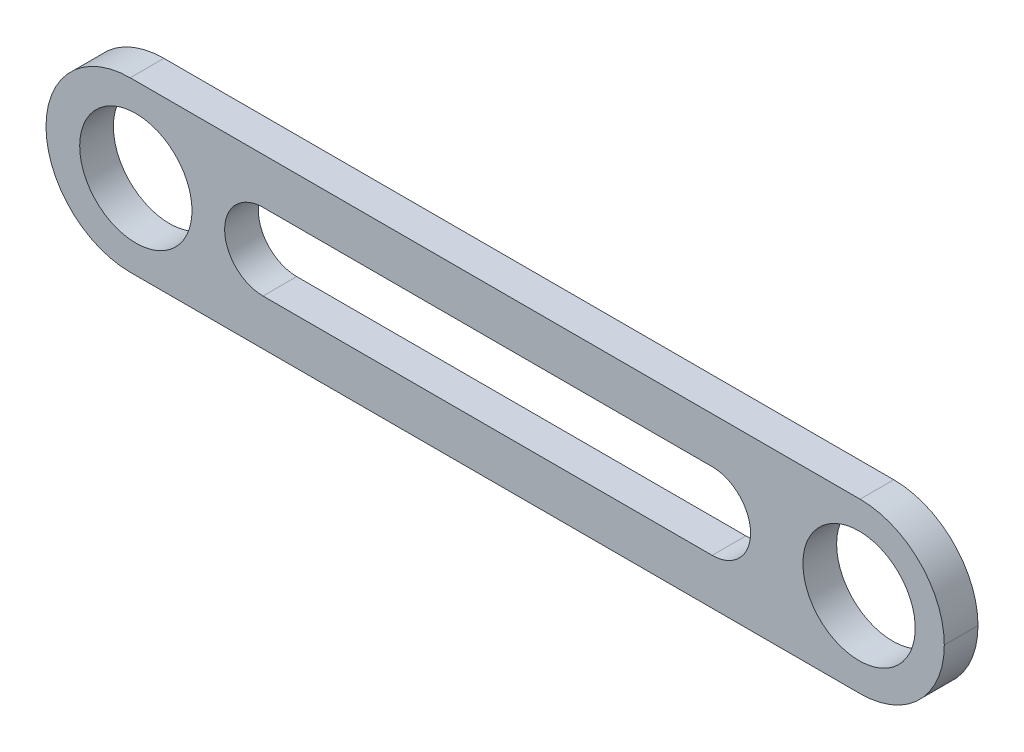
ISO-10303-21;
HEADER;
FILE_DESCRIPTION(('STEP AP214'),'2;1');
FILE_NAME('part.step','',(''),(''),'','','');
FILE_SCHEMA(('AUTOMOTIVE_DESIGN { 1 0 10303 214 1 1 1 1 }'));
ENDSEC;
DATA;
#1=APPLICATION_CONTEXT('core data for automotive mechanical design processes');
#2=APPLICATION_PROTOCOL_DEFINITION('international standard','automotive_design',2000,#1);
#3=PRODUCT_CONTEXT('',#1,'mechanical');
#4=PRODUCT('Part','Part','',(#3));
#5=PRODUCT_RELATED_PRODUCT_CATEGORY('part','',(#4));
#6=PRODUCT_DEFINITION_FORMATION('','',#4);
#7=PRODUCT_DEFINITION_CONTEXT('part definition',#1,'design');
#8=PRODUCT_DEFINITION('design','',#6,#7);
#9=PRODUCT_DEFINITION_SHAPE('','',#8);
#10=(LENGTH_UNIT() NAMED_UNIT(*) SI_UNIT(.MILLI.,.METRE.));
#11=(NAMED_UNIT(*) PLANE_ANGLE_UNIT() SI_UNIT($,.RADIAN.));
#12=(NAMED_UNIT(*) SI_UNIT($,.STERADIAN.) SOLID_ANGLE_UNIT());
#13=UNCERTAINTY_MEASURE_WITH_UNIT(LENGTH_MEASURE(1.E-05),#10,'distance_accuracy_value','');
#14=(GEOMETRIC_REPRESENTATION_CONTEXT(3) GLOBAL_UNCERTAINTY_ASSIGNED_CONTEXT((#13)) GLOBAL_UNIT_ASSIGNED_CONTEXT((#10,
#11,#12)) REPRESENTATION_CONTEXT('',''));
#15=CARTESIAN_POINT('',(0.,0.,0.));
#16=DIRECTION('',(0.,0.,1.));
#17=DIRECTION('',(1.,0.,0.));
#18=AXIS2_PLACEMENT_3D('',#15,#16,#17);
#19=CARTESIAN_POINT('',(0.,0.,7.62));
#20=DIRECTION('',(0.,0.,-1.));
#21=DIRECTION('',(-1.,0.,0.));
#22=AXIS2_PLACEMENT_3D('',#19,#20,#21);
#23=PLANE('',#22);
#24=CARTESIAN_POINT('',(-81.28,0.,7.62));
#25=DIRECTION('',(0.,0.,1.));
#26=DIRECTION('',(1.,0.,0.));
#27=AXIS2_PLACEMENT_3D('',#24,#25,#26);
#28=CIRCLE('',#27,12.7);
#29=CARTESIAN_POINT('',(-93.98,0.,7.62));
#30=VERTEX_POINT('',#29);
#31=EDGE_CURVE('E180',#30,#30,#28,.T.);
#32=ORIENTED_EDGE('',*,*,#31,.F.);
#33=EDGE_LOOP('',(#32));
#34=FACE_BOUND('',#33,.T.);
#35=DIRECTION('',(1.,0.,0.));
#36=VECTOR('',#35,1.);
#37=CARTESIAN_POINT('',(-101.6,-19.05,7.62));
#38=LINE('',#37,#36);
#39=CARTESIAN_POINT('',(-82.55,-19.05,7.62));
#40=VERTEX_POINT('',#39);
#41=CARTESIAN_POINT('',(82.55,-19.05,7.62));
#42=VERTEX_POINT('',#41);
#43=EDGE_CURVE('E191',#40,#42,#38,.T.);
#44=ORIENTED_EDGE('',*,*,#43,.T.);
#45=CARTESIAN_POINT('',(82.55,0.,7.62));
#46=DIRECTION('',(0.,0.,-1.));
#47=DIRECTION('',(-1.,0.,0.));
#48=AXIS2_PLACEMENT_3D('',#45,#46,#47);
#49=CIRCLE('',#48,19.05);
#50=CARTESIAN_POINT('',(101.6,0.,7.62));
#51=VERTEX_POINT('',#50);
#52=EDGE_CURVE('E229',#42,#51,#49,.F.);
#53=ORIENTED_EDGE('',*,*,#52,.T.);
#54=CARTESIAN_POINT('',(82.55,0.,7.62));
#55=DIRECTION('',(0.,0.,-1.));
#56=DIRECTION('',(-1.,0.,0.));
#57=AXIS2_PLACEMENT_3D('',#54,#55,#56);
#58=CIRCLE('',#57,19.05);
#59=CARTESIAN_POINT('',(82.55,19.05,7.62));
#60=VERTEX_POINT('',#59);
#61=EDGE_CURVE('E226',#51,#60,#58,.F.);
#62=ORIENTED_EDGE('',*,*,#61,.T.);
#63=DIRECTION('',(-1.,0.,0.));
#64=VECTOR('',#63,1.);
#65=CARTESIAN_POINT('',(-101.6,19.05,7.62));
#66=LINE('',#65,#64);
#67=CARTESIAN_POINT('',(-82.55,19.05,7.62));
#68=VERTEX_POINT('',#67);
#69=EDGE_CURVE('E188',#60,#68,#66,.T.);
#70=ORIENTED_EDGE('',*,*,#69,.T.);
#71=CARTESIAN_POINT('',(-82.55,0.,7.62));
#72=DIRECTION('',(0.,0.,-1.));
#73=DIRECTION('',(-1.,0.,0.));
#74=AXIS2_PLACEMENT_3D('',#71,#72,#73);
#75=CIRCLE('',#74,19.05);
#76=CARTESIAN_POINT('',(-101.6,0.,7.62));
#77=VERTEX_POINT('',#76);
#78=EDGE_CURVE('E61',#68,#77,#75,.F.);
#79=ORIENTED_EDGE('',*,*,#78,.T.);
#80=CARTESIAN_POINT('',(-82.55,0.,7.62));
#81=DIRECTION('',(0.,0.,-1.));
#82=DIRECTION('',(-1.,0.,0.));
#83=AXIS2_PLACEMENT_3D('',#80,#81,#82);
#84=CIRCLE('',#83,19.05);
#85=EDGE_CURVE('E223',#77,#40,#84,.F.);
#86=ORIENTED_EDGE('',*,*,#85,.T.);
#87=EDGE_LOOP('',(#44,#53,#62,#70,#79,#86));
#88=FACE_BOUND('',#87,.T.);
#89=CARTESIAN_POINT('',(-52.5116076429708,0.,7.62));
#90=DIRECTION('',(0.,0.,1.));
#91=DIRECTION('',(1.,0.,0.));
#92=AXIS2_PLACEMENT_3D('',#89,#90,#91);
#93=CIRCLE('',#92,8.68298343377441);
#94=CARTESIAN_POINT('',(-52.5116076429708,8.68298343377441,7.62));
#95=VERTEX_POINT('',#94);
#96=CARTESIAN_POINT('',(-52.5116076429708,-8.68298343377441,7.62));
#97=VERTEX_POINT('',#96);
#98=EDGE_CURVE('E124',#95,#97,#93,.T.);
#99=ORIENTED_EDGE('',*,*,#98,.F.);
#100=DIRECTION('',(-1.,0.,0.));
#101=VECTOR('',#100,1.);
#102=CARTESIAN_POINT('',(-52.5116076429708,8.68298343377441,7.62));
#103=LINE('',#102,#101);
#104=CARTESIAN_POINT('',(49.0883923570292,8.68298343377441,7.62));
#105=VERTEX_POINT('',#104);
#106=EDGE_CURVE('E154',#105,#95,#103,.T.);
#107=ORIENTED_EDGE('',*,*,#106,.F.);
#108=CARTESIAN_POINT('',(49.0883923570292,0.,7.62));
#109=DIRECTION('',(0.,0.,1.));
#110=DIRECTION('',(1.,0.,0.));
#111=AXIS2_PLACEMENT_3D('',#108,#109,#110);
#112=CIRCLE('',#111,8.68298343377441);
#113=CARTESIAN_POINT('',(49.0883923570292,-8.68298343377441,7.62));
#114=VERTEX_POINT('',#113);
#115=EDGE_CURVE('E150',#114,#105,#112,.T.);
#116=ORIENTED_EDGE('',*,*,#115,.F.);
#117=DIRECTION('',(1.,0.,0.));
#118=VECTOR('',#117,1.);
#119=CARTESIAN_POINT('',(-52.5116076429708,-8.68298343377441,7.62));
#120=LINE('',#119,#118);
#121=EDGE_CURVE('E135',#97,#114,#120,.T.);
#122=ORIENTED_EDGE('',*,*,#121,.F.);
#123=EDGE_LOOP('',(#99,#107,#116,#122));
#124=FACE_BOUND('',#123,.T.);
#125=CARTESIAN_POINT('',(82.3177780226245,0.,7.62));
#126=DIRECTION('',(0.,0.,1.));
#127=DIRECTION('',(1.,0.,0.));
#128=AXIS2_PLACEMENT_3D('',#125,#126,#127);
#129=CIRCLE('',#128,12.7);
#130=CARTESIAN_POINT('',(69.6177780226245,0.,7.62));
#131=VERTEX_POINT('',#130);
#132=EDGE_CURVE('E163',#131,#131,#129,.T.);
#133=ORIENTED_EDGE('',*,*,#132,.F.);
#134=EDGE_LOOP('',(#133));
#135=FACE_BOUND('',#134,.T.);
#136=ADVANCED_FACE('F43',(#34,#88,#124,#135),#23,.F.);
#137=CARTESIAN_POINT('',(0.,0.,0.));
#138=DIRECTION('',(0.,0.,-1.));
#139=DIRECTION('',(-1.,0.,0.));
#140=AXIS2_PLACEMENT_3D('',#137,#138,#139);
#141=PLANE('',#140);
#142=DIRECTION('',(-1.,0.,0.));
#143=VECTOR('',#142,1.);
#144=CARTESIAN_POINT('',(-52.5116076429708,8.68298343377441,0.));
#145=LINE('',#144,#143);
#146=CARTESIAN_POINT('',(49.0883923570292,8.68298343377441,0.));
#147=VERTEX_POINT('',#146);
#148=CARTESIAN_POINT('',(-52.5116076429708,8.68298343377441,0.));
#149=VERTEX_POINT('',#148);
#150=EDGE_CURVE('E136',#147,#149,#145,.T.);
#151=ORIENTED_EDGE('',*,*,#150,.T.);
#152=CARTESIAN_POINT('',(-52.5116076429708,0.,0.));
#153=DIRECTION('',(0.,0.,1.));
#154=DIRECTION('',(1.,0.,0.));
#155=AXIS2_PLACEMENT_3D('',#152,#153,#154);
#156=CIRCLE('',#155,8.68298343377441);
#157=CARTESIAN_POINT('',(-52.5116076429708,-8.68298343377441,0.));
#158=VERTEX_POINT('',#157);
#159=EDGE_CURVE('E160',#149,#158,#156,.T.);
#160=ORIENTED_EDGE('',*,*,#159,.T.);
#161=DIRECTION('',(1.,0.,0.));
#162=VECTOR('',#161,1.);
#163=CARTESIAN_POINT('',(-52.5116076429708,-8.68298343377441,0.));
#164=LINE('',#163,#162);
#165=CARTESIAN_POINT('',(49.0883923570292,-8.68298343377441,0.));
#166=VERTEX_POINT('',#165);
#167=EDGE_CURVE('E142',#158,#166,#164,.T.);
#168=ORIENTED_EDGE('',*,*,#167,.T.);
#169=CARTESIAN_POINT('',(49.0883923570292,0.,0.));
#170=DIRECTION('',(0.,0.,1.));
#171=DIRECTION('',(1.,0.,0.));
#172=AXIS2_PLACEMENT_3D('',#169,#170,#171);
#173=CIRCLE('',#172,8.68298343377441);
#174=EDGE_CURVE('E166',#166,#147,#173,.T.);
#175=ORIENTED_EDGE('',*,*,#174,.T.);
#176=EDGE_LOOP('',(#151,#160,#168,#175));
#177=FACE_BOUND('',#176,.T.);
#178=CARTESIAN_POINT('',(-81.28,0.,0.));
#179=DIRECTION('',(0.,0.,1.));
#180=DIRECTION('',(1.,0.,0.));
#181=AXIS2_PLACEMENT_3D('',#178,#179,#180);
#182=CIRCLE('',#181,12.7);
#183=CARTESIAN_POINT('',(-93.98,0.,0.));
#184=VERTEX_POINT('',#183);
#185=EDGE_CURVE('E144',#184,#184,#182,.T.);
#186=ORIENTED_EDGE('',*,*,#185,.T.);
#187=EDGE_LOOP('',(#186));
#188=FACE_BOUND('',#187,.T.);
#189=CARTESIAN_POINT('',(82.55,0.,0.));
#190=DIRECTION('',(0.,0.,-1.));
#191=DIRECTION('',(-1.,0.,0.));
#192=AXIS2_PLACEMENT_3D('',#189,#190,#191);
#193=CIRCLE('',#192,19.05);
#194=CARTESIAN_POINT('',(82.55,19.05,0.));
#195=VERTEX_POINT('',#194);
#196=CARTESIAN_POINT('',(101.6,0.,0.));
#197=VERTEX_POINT('',#196);
#198=EDGE_CURVE('E207',#195,#197,#193,.T.);
#199=ORIENTED_EDGE('',*,*,#198,.T.);
#200=CARTESIAN_POINT('',(82.55,0.,0.));
#201=DIRECTION('',(0.,0.,-1.));
#202=DIRECTION('',(-1.,0.,0.));
#203=AXIS2_PLACEMENT_3D('',#200,#201,#202);
#204=CIRCLE('',#203,19.05);
#205=CARTESIAN_POINT('',(82.55,-19.05,0.));
#206=VERTEX_POINT('',#205);
#207=EDGE_CURVE('E210',#197,#206,#204,.T.);
#208=ORIENTED_EDGE('',*,*,#207,.T.);
#209=DIRECTION('',(1.,0.,0.));
#210=VECTOR('',#209,1.);
#211=CARTESIAN_POINT('',(-101.6,-19.05,0.));
#212=LINE('',#211,#210);
#213=CARTESIAN_POINT('',(-82.55,-19.05,0.));
#214=VERTEX_POINT('',#213);
#215=EDGE_CURVE('E192',#214,#206,#212,.T.);
#216=ORIENTED_EDGE('',*,*,#215,.F.);
#217=CARTESIAN_POINT('',(-82.55,0.,0.));
#218=DIRECTION('',(0.,0.,-1.));
#219=DIRECTION('',(-1.,0.,0.));
#220=AXIS2_PLACEMENT_3D('',#217,#218,#219);
#221=CIRCLE('',#220,19.05);
#222=CARTESIAN_POINT('',(-101.6,0.,0.));
#223=VERTEX_POINT('',#222);
#224=EDGE_CURVE('E204',#214,#223,#221,.T.);
#225=ORIENTED_EDGE('',*,*,#224,.T.);
#226=CARTESIAN_POINT('',(-82.55,0.,0.));
#227=DIRECTION('',(0.,0.,-1.));
#228=DIRECTION('',(-1.,0.,0.));
#229=AXIS2_PLACEMENT_3D('',#226,#227,#228);
#230=CIRCLE('',#229,19.05);
#231=CARTESIAN_POINT('',(-82.55,19.05,0.));
#232=VERTEX_POINT('',#231);
#233=EDGE_CURVE('E196',#223,#232,#230,.T.);
#234=ORIENTED_EDGE('',*,*,#233,.T.);
#235=DIRECTION('',(-1.,0.,0.));
#236=VECTOR('',#235,1.);
#237=CARTESIAN_POINT('',(-101.6,19.05,0.));
#238=LINE('',#237,#236);
#239=EDGE_CURVE('E184',#195,#232,#238,.T.);
#240=ORIENTED_EDGE('',*,*,#239,.F.);
#241=EDGE_LOOP('',(#199,#208,#216,#225,#234,#240));
#242=FACE_BOUND('',#241,.T.);
#243=CARTESIAN_POINT('',(82.3177780226245,0.,0.));
#244=DIRECTION('',(0.,0.,1.));
#245=DIRECTION('',(1.,0.,0.));
#246=AXIS2_PLACEMENT_3D('',#243,#244,#245);
#247=CIRCLE('',#246,12.7);
#248=CARTESIAN_POINT('',(69.6177780226245,0.,0.));
#249=VERTEX_POINT('',#248);
#250=EDGE_CURVE('E236',#249,#249,#247,.T.);
#251=ORIENTED_EDGE('',*,*,#250,.T.);
#252=EDGE_LOOP('',(#251));
#253=FACE_BOUND('',#252,.T.);
#254=ADVANCED_FACE('F252',(#177,#188,#242,#253),#141,.T.);
#255=CARTESIAN_POINT('',(-101.6,19.05,7.62));
#256=DIRECTION('',(0.,-1.,0.));
#257=DIRECTION('',(0.,0.,-1.));
#258=AXIS2_PLACEMENT_3D('',#255,#256,#257);
#259=PLANE('',#258);
#260=ORIENTED_EDGE('',*,*,#69,.F.);
#261=DIRECTION('',(0.,0.,-1.));
#262=VECTOR('',#261,1.);
#263=CARTESIAN_POINT('',(82.55,19.05,7.62));
#264=LINE('',#263,#262);
#265=EDGE_CURVE('E11',#60,#195,#264,.T.);
#266=ORIENTED_EDGE('',*,*,#265,.T.);
#267=ORIENTED_EDGE('',*,*,#239,.T.);
#268=DIRECTION('',(0.,0.,-1.));
#269=VECTOR('',#268,1.);
#270=CARTESIAN_POINT('',(-82.55,19.05,7.62));
#271=LINE('',#270,#269);
#272=EDGE_CURVE('E53',#232,#68,#271,.F.);
#273=ORIENTED_EDGE('',*,*,#272,.T.);
#274=EDGE_LOOP('',(#260,#266,#267,#273));
#275=FACE_BOUND('',#274,.T.);
#276=ADVANCED_FACE('F256',(#275),#259,.F.);
#277=CARTESIAN_POINT('',(-101.6,-19.05,7.62));
#278=DIRECTION('',(0.,1.,0.));
#279=DIRECTION('',(0.,0.,1.));
#280=AXIS2_PLACEMENT_3D('',#277,#278,#279);
#281=PLANE('',#280);
#282=ORIENTED_EDGE('',*,*,#215,.T.);
#283=DIRECTION('',(0.,0.,-1.));
#284=VECTOR('',#283,1.);
#285=CARTESIAN_POINT('',(82.55,-19.05,7.62));
#286=LINE('',#285,#284);
#287=EDGE_CURVE('E217',#206,#42,#286,.F.);
#288=ORIENTED_EDGE('',*,*,#287,.T.);
#289=ORIENTED_EDGE('',*,*,#43,.F.);
#290=DIRECTION('',(0.,0.,-1.));
#291=VECTOR('',#290,1.);
#292=CARTESIAN_POINT('',(-82.55,-19.05,7.62));
#293=LINE('',#292,#291);
#294=EDGE_CURVE('E213',#40,#214,#293,.T.);
#295=ORIENTED_EDGE('',*,*,#294,.T.);
#296=EDGE_LOOP('',(#282,#288,#289,#295));
#297=FACE_BOUND('',#296,.T.);
#298=ADVANCED_FACE('F263',(#297),#281,.F.);
#299=CARTESIAN_POINT('',(-81.28,0.,7.62));
#300=DIRECTION('',(0.,0.,-1.));
#301=DIRECTION('',(-1.,0.,0.));
#302=AXIS2_PLACEMENT_3D('',#299,#300,#301);
#303=CYLINDRICAL_SURFACE('',#302,12.7);
#304=CARTESIAN_POINT('',(-93.98,0.,7.62));
#305=CARTESIAN_POINT('',(-93.98,0.,7.540625));
#306=CARTESIAN_POINT('',(-93.98,0.,7.46125));
#307=CARTESIAN_POINT('',(-93.98,0.,7.3025));
#308=CARTESIAN_POINT('',(-93.98,0.,7.223125));
#309=CARTESIAN_POINT('',(-93.98,0.,7.064375));
#310=CARTESIAN_POINT('',(-93.98,0.,6.985));
#311=CARTESIAN_POINT('',(-93.98,0.,6.82625));
#312=CARTESIAN_POINT('',(-93.98,0.,6.746875));
#313=CARTESIAN_POINT('',(-93.98,0.,6.588125));
#314=CARTESIAN_POINT('',(-93.98,0.,6.50875));
#315=CARTESIAN_POINT('',(-93.98,0.,6.35));
#316=CARTESIAN_POINT('',(-93.98,0.,6.270625));
#317=CARTESIAN_POINT('',(-93.98,0.,6.111875));
#318=CARTESIAN_POINT('',(-93.98,0.,6.0325));
#319=CARTESIAN_POINT('',(-93.98,0.,5.87375));
#320=CARTESIAN_POINT('',(-93.98,0.,5.794375));
#321=CARTESIAN_POINT('',(-93.98,0.,5.635625));
#322=CARTESIAN_POINT('',(-93.98,0.,5.55625));
#323=CARTESIAN_POINT('',(-93.98,0.,5.3975));
#324=CARTESIAN_POINT('',(-93.98,0.,5.318125));
#325=CARTESIAN_POINT('',(-93.98,0.,5.159375));
#326=CARTESIAN_POINT('',(-93.98,0.,5.08));
#327=CARTESIAN_POINT('',(-93.98,0.,4.92125));
#328=CARTESIAN_POINT('',(-93.98,0.,4.841875));
#329=CARTESIAN_POINT('',(-93.98,0.,4.683125));
#330=CARTESIAN_POINT('',(-93.98,0.,4.60375));
#331=CARTESIAN_POINT('',(-93.98,0.,4.445));
#332=CARTESIAN_POINT('',(-93.98,0.,4.365625));
#333=CARTESIAN_POINT('',(-93.98,0.,4.206875));
#334=CARTESIAN_POINT('',(-93.98,0.,4.1275));
#335=CARTESIAN_POINT('',(-93.98,0.,3.96875));
#336=CARTESIAN_POINT('',(-93.98,0.,3.889375));
#337=CARTESIAN_POINT('',(-93.98,0.,3.730625));
#338=CARTESIAN_POINT('',(-93.98,0.,3.65125));
#339=CARTESIAN_POINT('',(-93.98,0.,3.4925));
#340=CARTESIAN_POINT('',(-93.98,0.,3.413125));
#341=CARTESIAN_POINT('',(-93.98,0.,3.254375));
#342=CARTESIAN_POINT('',(-93.98,0.,3.175));
#343=CARTESIAN_POINT('',(-93.98,0.,3.01625));
#344=CARTESIAN_POINT('',(-93.98,0.,2.936875));
#345=CARTESIAN_POINT('',(-93.98,0.,2.778125));
#346=CARTESIAN_POINT('',(-93.98,0.,2.69875));
#347=CARTESIAN_POINT('',(-93.98,0.,2.54));
#348=CARTESIAN_POINT('',(-93.98,0.,2.460625));
#349=CARTESIAN_POINT('',(-93.98,0.,2.301875));
#350=CARTESIAN_POINT('',(-93.98,0.,2.2225));
#351=CARTESIAN_POINT('',(-93.98,0.,2.06375));
#352=CARTESIAN_POINT('',(-93.98,0.,1.984375));
#353=CARTESIAN_POINT('',(-93.98,0.,1.825625));
#354=CARTESIAN_POINT('',(-93.98,0.,1.74625));
#355=CARTESIAN_POINT('',(-93.98,0.,1.5875));
#356=CARTESIAN_POINT('',(-93.98,0.,1.508125));
#357=CARTESIAN_POINT('',(-93.98,0.,1.349375));
#358=CARTESIAN_POINT('',(-93.98,0.,1.27));
#359=CARTESIAN_POINT('',(-93.98,0.,1.11125));
#360=CARTESIAN_POINT('',(-93.98,0.,1.031875));
#361=CARTESIAN_POINT('',(-93.98,0.,0.873125));
#362=CARTESIAN_POINT('',(-93.98,0.,0.79375));
#363=CARTESIAN_POINT('',(-93.98,0.,0.635));
#364=CARTESIAN_POINT('',(-93.98,0.,0.555625));
#365=CARTESIAN_POINT('',(-93.98,0.,0.396875));
#366=CARTESIAN_POINT('',(-93.98,0.,0.3175));
#367=CARTESIAN_POINT('',(-93.98,0.,0.15875));
#368=CARTESIAN_POINT('',(-93.98,0.,0.0793749999999999));
#369=CARTESIAN_POINT('',(-93.98,0.,0.));
#370=B_SPLINE_CURVE_WITH_KNOTS('',3,(#304,#305,#306,#307,#308,#309,#310,#311,#312,#313,#314,
#315,#316,#317,#318,#319,#320,#321,#322,#323,#324,#325,#326,#327,#328,#329,#330,#331,#332,#333,
#334,#335,#336,#337,#338,#339,#340,#341,#342,#343,#344,#345,#346,#347,#348,#349,#350,#351,#352,
#353,#354,#355,#356,#357,#358,#359,#360,#361,#362,#363,#364,#365,#366,#367,#368,#369),
.UNSPECIFIED.,.F.,.F.,(4,2,2,2,2,2,2,2,2,2,2,2,2,2,2,2,2,2,2,2,2,2,2,2,2,2,2,2,2,2,2,2,4),(0.,
0.238125,0.47625,0.714375000000001,0.9525,1.190625,1.42875,1.666875,1.905,2.143125,2.38125,
2.619375,2.8575,3.095625,3.33375,3.571875,3.81,4.048125,4.28625,4.524375,4.7625,5.000625,
5.23875,5.476875,5.715,5.953125,6.19125,6.429375,6.6675,6.905625,7.14375,7.381875,7.62),.UNSPECIFIED.);
#371=EDGE_CURVE('BSEAM276',#30,#184,#370,.T.);
#372=ORIENTED_EDGE('',*,*,#31,.T.);
#373=ORIENTED_EDGE('',*,*,#185,.F.);
#374=ORIENTED_EDGE('',*,*,#371,.T.);
#375=ORIENTED_EDGE('',*,*,#371,.F.);
#376=EDGE_LOOP('',(#372,#374,#373,#375));
#377=FACE_BOUND('',#376,.T.);
#378=ADVANCED_FACE('F276',(#377),#303,.F.);
#379=CARTESIAN_POINT('',(-52.5116076429708,0.,7.62));
#380=DIRECTION('',(0.,0.,-1.));
#381=DIRECTION('',(-1.,0.,0.));
#382=AXIS2_PLACEMENT_3D('',#379,#380,#381);
#383=CYLINDRICAL_SURFACE('',#382,8.68298343377441);
#384=ORIENTED_EDGE('',*,*,#159,.F.);
#385=DIRECTION('',(0.,0.,-1.));
#386=VECTOR('',#385,1.);
#387=CARTESIAN_POINT('',(-52.5116076429708,8.68298343377441,7.62));
#388=LINE('',#387,#386);
#389=EDGE_CURVE('E130',#95,#149,#388,.T.);
#390=ORIENTED_EDGE('',*,*,#389,.F.);
#391=ORIENTED_EDGE('',*,*,#98,.T.);
#392=DIRECTION('',(0.,0.,-1.));
#393=VECTOR('',#392,1.);
#394=CARTESIAN_POINT('',(-52.5116076429708,-8.68298343377441,7.62));
#395=LINE('',#394,#393);
#396=EDGE_CURVE('E127',#97,#158,#395,.T.);
#397=ORIENTED_EDGE('',*,*,#396,.T.);
#398=EDGE_LOOP('',(#384,#390,#391,#397));
#399=FACE_BOUND('',#398,.T.);
#400=ADVANCED_FACE('F126',(#399),#383,.F.);
#401=CARTESIAN_POINT('',(-52.5116076429708,-8.68298343377441,7.62));
#402=DIRECTION('',(0.,1.,0.));
#403=DIRECTION('',(0.,0.,1.));
#404=AXIS2_PLACEMENT_3D('',#401,#402,#403);
#405=PLANE('',#404);
#406=ORIENTED_EDGE('',*,*,#167,.F.);
#407=ORIENTED_EDGE('',*,*,#396,.F.);
#408=ORIENTED_EDGE('',*,*,#121,.T.);
#409=DIRECTION('',(0.,0.,-1.));
#410=VECTOR('',#409,1.);
#411=CARTESIAN_POINT('',(49.0883923570292,-8.68298343377441,7.62));
#412=LINE('',#411,#410);
#413=EDGE_CURVE('E145',#114,#166,#412,.T.);
#414=ORIENTED_EDGE('',*,*,#413,.T.);
#415=EDGE_LOOP('',(#406,#407,#408,#414));
#416=FACE_BOUND('',#415,.T.);
#417=ADVANCED_FACE('F139',(#416),#405,.T.);
#418=CARTESIAN_POINT('',(49.0883923570292,0.,7.62));
#419=DIRECTION('',(0.,0.,-1.));
#420=DIRECTION('',(-1.,0.,0.));
#421=AXIS2_PLACEMENT_3D('',#418,#419,#420);
#422=CYLINDRICAL_SURFACE('',#421,8.68298343377441);
#423=ORIENTED_EDGE('',*,*,#174,.F.);
#424=ORIENTED_EDGE('',*,*,#413,.F.);
#425=ORIENTED_EDGE('',*,*,#115,.T.);
#426=DIRECTION('',(0.,0.,-1.));
#427=VECTOR('',#426,1.);
#428=CARTESIAN_POINT('',(49.0883923570292,8.68298343377441,7.62));
#429=LINE('',#428,#427);
#430=EDGE_CURVE('E175',#105,#147,#429,.T.);
#431=ORIENTED_EDGE('',*,*,#430,.T.);
#432=EDGE_LOOP('',(#423,#424,#425,#431));
#433=FACE_BOUND('',#432,.T.);
#434=ADVANCED_FACE('F316',(#433),#422,.F.);
#435=CARTESIAN_POINT('',(-52.5116076429708,8.68298343377441,7.62));
#436=DIRECTION('',(0.,-1.,0.));
#437=DIRECTION('',(0.,0.,-1.));
#438=AXIS2_PLACEMENT_3D('',#435,#436,#437);
#439=PLANE('',#438);
#440=ORIENTED_EDGE('',*,*,#150,.F.);
#441=ORIENTED_EDGE('',*,*,#430,.F.);
#442=ORIENTED_EDGE('',*,*,#106,.T.);
#443=ORIENTED_EDGE('',*,*,#389,.T.);
#444=EDGE_LOOP('',(#440,#441,#442,#443));
#445=FACE_BOUND('',#444,.T.);
#446=ADVANCED_FACE('F308',(#445),#439,.T.);
#447=CARTESIAN_POINT('',(82.3177780226245,0.,7.62));
#448=DIRECTION('',(0.,0.,-1.));
#449=DIRECTION('',(-1.,0.,0.));
#450=AXIS2_PLACEMENT_3D('',#447,#448,#449);
#451=CYLINDRICAL_SURFACE('',#450,12.7);
#452=CARTESIAN_POINT('',(69.6177780226245,0.,7.62));
#453=CARTESIAN_POINT('',(69.6177780226245,0.,7.540625));
#454=CARTESIAN_POINT('',(69.6177780226245,0.,7.46125));
#455=CARTESIAN_POINT('',(69.6177780226245,0.,7.3025));
#456=CARTESIAN_POINT('',(69.6177780226245,0.,7.223125));
#457=CARTESIAN_POINT('',(69.6177780226245,0.,7.064375));
#458=CARTESIAN_POINT('',(69.6177780226245,0.,6.985));
#459=CARTESIAN_POINT('',(69.6177780226245,0.,6.82625));
#460=CARTESIAN_POINT('',(69.6177780226245,0.,6.746875));
#461=CARTESIAN_POINT('',(69.6177780226245,0.,6.588125));
#462=CARTESIAN_POINT('',(69.6177780226245,0.,6.50875));
#463=CARTESIAN_POINT('',(69.6177780226245,0.,6.35));
#464=CARTESIAN_POINT('',(69.6177780226245,0.,6.270625));
#465=CARTESIAN_POINT('',(69.6177780226245,0.,6.111875));
#466=CARTESIAN_POINT('',(69.6177780226245,0.,6.0325));
#467=CARTESIAN_POINT('',(69.6177780226245,0.,5.87375));
#468=CARTESIAN_POINT('',(69.6177780226245,0.,5.794375));
#469=CARTESIAN_POINT('',(69.6177780226245,0.,5.635625));
#470=CARTESIAN_POINT('',(69.6177780226245,0.,5.55625));
#471=CARTESIAN_POINT('',(69.6177780226245,0.,5.3975));
#472=CARTESIAN_POINT('',(69.6177780226245,0.,5.318125));
#473=CARTESIAN_POINT('',(69.6177780226245,0.,5.159375));
#474=CARTESIAN_POINT('',(69.6177780226245,0.,5.08));
#475=CARTESIAN_POINT('',(69.6177780226245,0.,4.92125));
#476=CARTESIAN_POINT('',(69.6177780226245,0.,4.841875));
#477=CARTESIAN_POINT('',(69.6177780226245,0.,4.683125));
#478=CARTESIAN_POINT('',(69.6177780226245,0.,4.60375));
#479=CARTESIAN_POINT('',(69.6177780226245,0.,4.445));
#480=CARTESIAN_POINT('',(69.6177780226245,0.,4.365625));
#481=CARTESIAN_POINT('',(69.6177780226245,0.,4.206875));
#482=CARTESIAN_POINT('',(69.6177780226245,0.,4.1275));
#483=CARTESIAN_POINT('',(69.6177780226245,0.,3.96875));
#484=CARTESIAN_POINT('',(69.6177780226245,0.,3.889375));
#485=CARTESIAN_POINT('',(69.6177780226245,0.,3.730625));
#486=CARTESIAN_POINT('',(69.6177780226245,0.,3.65125));
#487=CARTESIAN_POINT('',(69.6177780226245,0.,3.4925));
#488=CARTESIAN_POINT('',(69.6177780226245,0.,3.413125));
#489=CARTESIAN_POINT('',(69.6177780226245,0.,3.254375));
#490=CARTESIAN_POINT('',(69.6177780226245,0.,3.175));
#491=CARTESIAN_POINT('',(69.6177780226245,0.,3.01625));
#492=CARTESIAN_POINT('',(69.6177780226245,0.,2.936875));
#493=CARTESIAN_POINT('',(69.6177780226245,0.,2.778125));
#494=CARTESIAN_POINT('',(69.6177780226245,0.,2.69875));
#495=CARTESIAN_POINT('',(69.6177780226245,0.,2.54));
#496=CARTESIAN_POINT('',(69.6177780226245,0.,2.460625));
#497=CARTESIAN_POINT('',(69.6177780226245,0.,2.301875));
#498=CARTESIAN_POINT('',(69.6177780226245,0.,2.2225));
#499=CARTESIAN_POINT('',(69.6177780226245,0.,2.06375));
#500=CARTESIAN_POINT('',(69.6177780226245,0.,1.984375));
#501=CARTESIAN_POINT('',(69.6177780226245,0.,1.825625));
#502=CARTESIAN_POINT('',(69.6177780226245,0.,1.74625));
#503=CARTESIAN_POINT('',(69.6177780226245,0.,1.5875));
#504=CARTESIAN_POINT('',(69.6177780226245,0.,1.508125));
#505=CARTESIAN_POINT('',(69.6177780226245,0.,1.349375));
#506=CARTESIAN_POINT('',(69.6177780226245,0.,1.27));
#507=CARTESIAN_POINT('',(69.6177780226245,0.,1.11125));
#508=CARTESIAN_POINT('',(69.6177780226245,0.,1.031875));
#509=CARTESIAN_POINT('',(69.6177780226245,0.,0.873125));
#510=CARTESIAN_POINT('',(69.6177780226245,0.,0.79375));
#511=CARTESIAN_POINT('',(69.6177780226245,0.,0.635));
#512=CARTESIAN_POINT('',(69.6177780226245,0.,0.555625));
#513=CARTESIAN_POINT('',(69.6177780226245,0.,0.396875));
#514=CARTESIAN_POINT('',(69.6177780226245,0.,0.3175));
#515=CARTESIAN_POINT('',(69.6177780226245,0.,0.15875));
#516=CARTESIAN_POINT('',(69.6177780226245,0.,0.0793749999999999));
#517=CARTESIAN_POINT('',(69.6177780226245,0.,0.));
#518=B_SPLINE_CURVE_WITH_KNOTS('',3,(#452,#453,#454,#455,#456,#457,#458,#459,#460,#461,#462,
#463,#464,#465,#466,#467,#468,#469,#470,#471,#472,#473,#474,#475,#476,#477,#478,#479,#480,#481,
#482,#483,#484,#485,#486,#487,#488,#489,#490,#491,#492,#493,#494,#495,#496,#497,#498,#499,#500,
#501,#502,#503,#504,#505,#506,#507,#508,#509,#510,#511,#512,#513,#514,#515,#516,#517),
.UNSPECIFIED.,.F.,.F.,(4,2,2,2,2,2,2,2,2,2,2,2,2,2,2,2,2,2,2,2,2,2,2,2,2,2,2,2,2,2,2,2,4),(0.,
0.238125,0.47625,0.714375000000001,0.9525,1.190625,1.42875,1.666875,1.905,2.143125,2.38125,
2.619375,2.8575,3.095625,3.33375,3.571875,3.81,4.048125,4.28625,4.524375,4.7625,5.000625,
5.23875,5.476875,5.715,5.953125,6.19125,6.429375,6.6675,6.905625,7.14375,7.381875,7.62),.UNSPECIFIED.);
#519=EDGE_CURVE('BSEAM286',#131,#249,#518,.T.);
#520=ORIENTED_EDGE('',*,*,#132,.T.);
#521=ORIENTED_EDGE('',*,*,#250,.F.);
#522=ORIENTED_EDGE('',*,*,#519,.T.);
#523=ORIENTED_EDGE('',*,*,#519,.F.);
#524=EDGE_LOOP('',(#520,#522,#521,#523));
#525=FACE_BOUND('',#524,.T.);
#526=ADVANCED_FACE('F286',(#525),#451,.F.);
#527=CARTESIAN_POINT('',(82.55,0.,7.62));
#528=DIRECTION('',(0.,0.,-1.));
#529=DIRECTION('',(-1.,0.,0.));
#530=AXIS2_PLACEMENT_3D('',#527,#528,#529);
#531=CYLINDRICAL_SURFACE('',#530,19.05);
#532=ORIENTED_EDGE('',*,*,#265,.F.);
#533=ORIENTED_EDGE('',*,*,#61,.F.);
#534=DIRECTION('',(0.,0.,-1.));
#535=VECTOR('',#534,1.);
#536=CARTESIAN_POINT('',(101.6,0.,7.62));
#537=LINE('',#536,#535);
#538=EDGE_CURVE('E233',#197,#51,#537,.F.);
#539=ORIENTED_EDGE('',*,*,#538,.F.);
#540=ORIENTED_EDGE('',*,*,#198,.F.);
#541=EDGE_LOOP('',(#532,#533,#539,#540));
#542=FACE_BOUND('',#541,.T.);
#543=ADVANCED_FACE('F260',(#542),#531,.T.);
#544=CARTESIAN_POINT('',(82.55,0.,7.62));
#545=DIRECTION('',(0.,0.,-1.));
#546=DIRECTION('',(-1.,0.,0.));
#547=AXIS2_PLACEMENT_3D('',#544,#545,#546);
#548=CYLINDRICAL_SURFACE('',#547,19.05);
#549=ORIENTED_EDGE('',*,*,#52,.F.);
#550=ORIENTED_EDGE('',*,*,#287,.F.);
#551=ORIENTED_EDGE('',*,*,#207,.F.);
#552=ORIENTED_EDGE('',*,*,#538,.T.);
#553=EDGE_LOOP('',(#549,#550,#551,#552));
#554=FACE_BOUND('',#553,.T.);
#555=ADVANCED_FACE('F265',(#554),#548,.T.);
#556=CARTESIAN_POINT('',(-82.55,0.,7.62));
#557=DIRECTION('',(0.,0.,-1.));
#558=DIRECTION('',(-1.,0.,0.));
#559=AXIS2_PLACEMENT_3D('',#556,#557,#558);
#560=CYLINDRICAL_SURFACE('',#559,19.05);
#561=DIRECTION('',(0.,0.,-1.));
#562=VECTOR('',#561,1.);
#563=CARTESIAN_POINT('',(-101.6,0.,7.62));
#564=LINE('',#563,#562);
#565=EDGE_CURVE('E47',#77,#223,#564,.T.);
#566=ORIENTED_EDGE('',*,*,#565,.F.);
#567=ORIENTED_EDGE('',*,*,#78,.F.);
#568=ORIENTED_EDGE('',*,*,#272,.F.);
#569=ORIENTED_EDGE('',*,*,#233,.F.);
#570=EDGE_LOOP('',(#566,#567,#568,#569));
#571=FACE_BOUND('',#570,.T.);
#572=ADVANCED_FACE('F45',(#571),#560,.T.);
#573=CARTESIAN_POINT('',(-82.55,0.,7.62));
#574=DIRECTION('',(0.,0.,-1.));
#575=DIRECTION('',(-1.,0.,0.));
#576=AXIS2_PLACEMENT_3D('',#573,#574,#575);
#577=CYLINDRICAL_SURFACE('',#576,19.05);
#578=ORIENTED_EDGE('',*,*,#85,.F.);
#579=ORIENTED_EDGE('',*,*,#565,.T.);
#580=ORIENTED_EDGE('',*,*,#224,.F.);
#581=ORIENTED_EDGE('',*,*,#294,.F.);
#582=EDGE_LOOP('',(#578,#579,#580,#581));
#583=FACE_BOUND('',#582,.T.);
#584=ADVANCED_FACE('F246',(#583),#577,.T.);
#585=CLOSED_SHELL('',(#136,#254,#276,#298,#378,#400,#417,#434,#446,#526,#543,#555,#572,#584));
#586=MANIFOLD_SOLID_BREP('B2',#585);
#587=ADVANCED_BREP_SHAPE_REPRESENTATION('',(#18,#586),#14);
#588=SHAPE_DEFINITION_REPRESENTATION(#9,#587);
ENDSEC;
END-ISO-10303-21;
